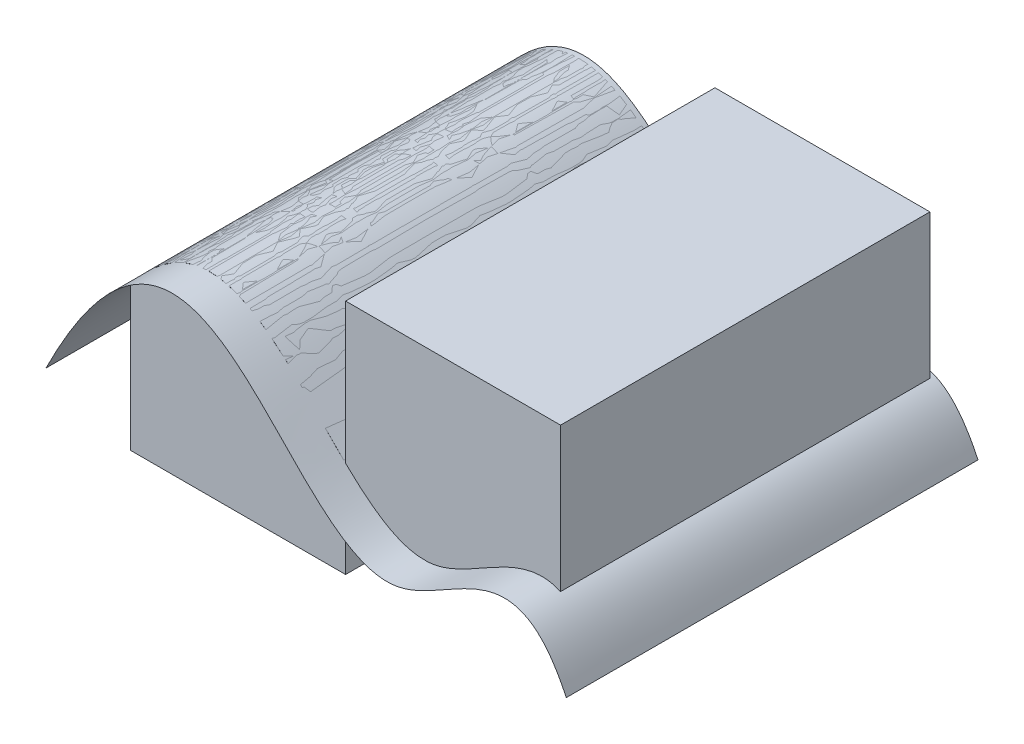
ISO-10303-21;
HEADER;
FILE_DESCRIPTION(('STEP AP214'),'2;1');
FILE_NAME('part.step','',(''),(''),'','','');
FILE_SCHEMA(('AUTOMOTIVE_DESIGN { 1 0 10303 214 1 1 1 1 }'));
ENDSEC;
DATA;
#1=APPLICATION_CONTEXT('core data for automotive mechanical design processes');
#2=APPLICATION_PROTOCOL_DEFINITION('international standard','automotive_design',2000,#1);
#3=PRODUCT_CONTEXT('',#1,'mechanical');
#4=PRODUCT('Part','Part','',(#3));
#5=PRODUCT_RELATED_PRODUCT_CATEGORY('part','',(#4));
#6=PRODUCT_DEFINITION_FORMATION('','',#4);
#7=PRODUCT_DEFINITION_CONTEXT('part definition',#1,'design');
#8=PRODUCT_DEFINITION('design','',#6,#7);
#9=PRODUCT_DEFINITION_SHAPE('','',#8);
#10=(LENGTH_UNIT() NAMED_UNIT(*) SI_UNIT(.MILLI.,.METRE.));
#11=(NAMED_UNIT(*) PLANE_ANGLE_UNIT() SI_UNIT($,.RADIAN.));
#12=(NAMED_UNIT(*) SI_UNIT($,.STERADIAN.) SOLID_ANGLE_UNIT());
#13=UNCERTAINTY_MEASURE_WITH_UNIT(LENGTH_MEASURE(1.E-05),#10,'distance_accuracy_value','');
#14=(GEOMETRIC_REPRESENTATION_CONTEXT(3) GLOBAL_UNCERTAINTY_ASSIGNED_CONTEXT((#13)) GLOBAL_UNIT_ASSIGNED_CONTEXT((#10,
#11,#12)) REPRESENTATION_CONTEXT('',''));
#15=CARTESIAN_POINT('',(0.,0.,0.));
#16=DIRECTION('',(0.,0.,1.));
#17=DIRECTION('',(1.,0.,0.));
#18=AXIS2_PLACEMENT_3D('',#15,#16,#17);
#19=CARTESIAN_POINT('',(0.,0.,0.));
#20=DIRECTION('',(1.,0.,0.));
#21=DIRECTION('',(0.,0.,-1.));
#22=AXIS2_PLACEMENT_3D('',#19,#20,#21);
#23=PLANE('',#22);
#24=DIRECTION('',(0.,0.,1.));
#25=VECTOR('',#24,1.);
#26=CARTESIAN_POINT('',(0.,0.,0.));
#27=LINE('',#26,#25);
#28=CARTESIAN_POINT('',(0.,0.,-62.6633162704457));
#29=VERTEX_POINT('',#28);
#30=CARTESIAN_POINT('',(0.,0.,62.6633162704457));
#31=VERTEX_POINT('',#30);
#32=EDGE_CURVE('E121',#29,#31,#27,.T.);
#33=ORIENTED_EDGE('',*,*,#32,.F.);
#34=DIRECTION('',(0.,1.,0.));
#35=VECTOR('',#34,1.);
#36=CARTESIAN_POINT('',(0.,80.3747042919709,-62.6633162704457));
#37=LINE('',#36,#35);
#38=CARTESIAN_POINT('',(-1.60461921527855E-13,32.6850280682945,-62.6633162704457));
#39=VERTEX_POINT('',#38);
#40=EDGE_CURVE('E129',#29,#39,#37,.T.);
#41=ORIENTED_EDGE('',*,*,#40,.T.);
#42=DIRECTION('',(0.,0.,-1.));
#43=VECTOR('',#42,1.);
#44=CARTESIAN_POINT('',(0.,32.6850280682944,62.6633162704457));
#45=LINE('',#44,#43);
#46=CARTESIAN_POINT('',(-1.60461921527855E-13,32.6850280682945,62.6633162704457));
#47=VERTEX_POINT('',#46);
#48=EDGE_CURVE('E123',#47,#39,#45,.T.);
#49=ORIENTED_EDGE('',*,*,#48,.F.);
#50=DIRECTION('',(0.,-1.,0.));
#51=VECTOR('',#50,1.);
#52=CARTESIAN_POINT('',(0.,80.3747042919709,62.6633162704457));
#53=LINE('',#52,#51);
#54=EDGE_CURVE('E112',#47,#31,#53,.T.);
#55=ORIENTED_EDGE('',*,*,#54,.T.);
#56=EDGE_LOOP('',(#33,#41,#49,#55));
#57=FACE_BOUND('',#56,.T.);
#58=ADVANCED_FACE('F67',(#57),#23,.T.);
#59=CARTESIAN_POINT('',(-88.9503624856376,22.5454685632026,62.6633162704457));
#60=CARTESIAN_POINT('',(-37.8141386567155,125.215292475116,62.6633162704457));
#61=CARTESIAN_POINT('',(5.84947542840995,-43.7179988687432,62.6633162704457));
#62=CARTESIAN_POINT('',(69.6437169043807,52.4820397279148,62.6633162704457));
#63=CARTESIAN_POINT('',(87.5841174456941,13.9727510125804,62.6633162704457));
#64=B_SPLINE_CURVE_WITH_KNOTS('',3,(#59,#60,#61,#62,#63),.UNSPECIFIED.,.F.,.F.,(4,1,4),(0.,
0.6650166527823,1.),.UNSPECIFIED.);
#65=DIRECTION('',(0.,0.,-1.));
#66=VECTOR('',#65,1.);
#67=SURFACE_OF_LINEAR_EXTRUSION('',#64,#66);
#68=ORIENTED_EDGE('',*,*,#48,.T.);
#69=CARTESIAN_POINT('',(-88.9503624856376,22.5454685632026,-62.6633162704457));
#70=CARTESIAN_POINT('',(-37.8141386567155,125.215292475116,-62.6633162704457));
#71=CARTESIAN_POINT('',(5.84947542840995,-43.7179988687432,-62.6633162704457));
#72=CARTESIAN_POINT('',(69.6437169043807,52.4820397279148,-62.6633162704457));
#73=CARTESIAN_POINT('',(87.5841174456941,13.9727510125804,-62.6633162704457));
#74=B_SPLINE_CURVE_WITH_KNOTS('',3,(#69,#70,#71,#72,#73),.UNSPECIFIED.,.F.,.F.,(4,1,4),(0.,
0.6650166527823,1.),.UNSPECIFIED.);
#75=CARTESIAN_POINT('',(-72.9401001387988,48.9314370628439,-62.6633162704457));
#76=VERTEX_POINT('',#75);
#77=EDGE_CURVE('E132',#39,#76,#74,.F.);
#78=ORIENTED_EDGE('',*,*,#77,.T.);
#79=DIRECTION('',(0.,0.,-1.));
#80=VECTOR('',#79,1.);
#81=CARTESIAN_POINT('',(-72.9401001387988,48.9314370628439,62.6633162704457));
#82=LINE('',#81,#80);
#83=CARTESIAN_POINT('',(-72.9401001387988,48.9314370687057,62.6633162704457));
#84=VERTEX_POINT('',#83);
#85=EDGE_CURVE('E124',#76,#84,#82,.F.);
#86=ORIENTED_EDGE('',*,*,#85,.T.);
#87=CARTESIAN_POINT('',(-88.9503624856376,22.5454685632026,62.6633162704457));
#88=CARTESIAN_POINT('',(-37.8141386567155,125.215292475116,62.6633162704457));
#89=CARTESIAN_POINT('',(5.84947542840995,-43.7179988687432,62.6633162704457));
#90=CARTESIAN_POINT('',(69.6437169043807,52.4820397279148,62.6633162704457));
#91=CARTESIAN_POINT('',(87.5841174456941,13.9727510125804,62.6633162704457));
#92=B_SPLINE_CURVE_WITH_KNOTS('',3,(#87,#88,#89,#90,#91),.UNSPECIFIED.,.F.,.F.,(4,1,4),(0.,
0.6650166527823,1.),.UNSPECIFIED.);
#93=EDGE_CURVE('E125',#84,#47,#92,.T.);
#94=ORIENTED_EDGE('',*,*,#93,.T.);
#95=EDGE_LOOP('',(#68,#78,#86,#94));
#96=FACE_BOUND('',#95,.T.);
#97=ADVANCED_FACE('F69',(#96),#67,.T.);
#98=CARTESIAN_POINT('',(-72.9401001387988,80.3747042919709,62.6633162704457));
#99=DIRECTION('',(1.,0.,0.));
#100=DIRECTION('',(0.,0.,-1.));
#101=AXIS2_PLACEMENT_3D('',#98,#99,#100);
#102=PLANE('',#101);
#103=ORIENTED_EDGE('',*,*,#85,.F.);
#104=DIRECTION('',(0.,-1.,0.));
#105=VECTOR('',#104,1.);
#106=CARTESIAN_POINT('',(-72.9401001387988,80.3747042919709,-62.6633162704457));
#107=LINE('',#106,#105);
#108=CARTESIAN_POINT('',(-72.9401001387988,0.,-62.6633162704457));
#109=VERTEX_POINT('',#108);
#110=EDGE_CURVE('E86',#76,#109,#107,.T.);
#111=ORIENTED_EDGE('',*,*,#110,.T.);
#112=DIRECTION('',(0.,0.,1.));
#113=VECTOR('',#112,1.);
#114=CARTESIAN_POINT('',(-72.9401001387988,0.,62.6633162704457));
#115=LINE('',#114,#113);
#116=CARTESIAN_POINT('',(-72.9401001387988,0.,62.6633162704457));
#117=VERTEX_POINT('',#116);
#118=EDGE_CURVE('E78',#109,#117,#115,.T.);
#119=ORIENTED_EDGE('',*,*,#118,.T.);
#120=DIRECTION('',(0.,-1.,0.));
#121=VECTOR('',#120,1.);
#122=CARTESIAN_POINT('',(-72.9401001387988,80.3747042919709,62.6633162704457));
#123=LINE('',#122,#121);
#124=EDGE_CURVE('E93',#84,#117,#123,.T.);
#125=ORIENTED_EDGE('',*,*,#124,.F.);
#126=EDGE_LOOP('',(#103,#111,#119,#125));
#127=FACE_BOUND('',#126,.T.);
#128=ADVANCED_FACE('F151',(#127),#102,.F.);
#129=CARTESIAN_POINT('',(-72.9401001387988,80.3747042919709,62.6633162704457));
#130=DIRECTION('',(0.,0.,-1.));
#131=DIRECTION('',(-1.,0.,0.));
#132=AXIS2_PLACEMENT_3D('',#129,#130,#131);
#133=PLANE('',#132);
#134=ORIENTED_EDGE('',*,*,#54,.F.);
#135=ORIENTED_EDGE('',*,*,#93,.F.);
#136=ORIENTED_EDGE('',*,*,#124,.T.);
#137=DIRECTION('',(1.,0.,0.));
#138=VECTOR('',#137,1.);
#139=CARTESIAN_POINT('',(-72.9401001387988,0.,62.6633162704457));
#140=LINE('',#139,#138);
#141=EDGE_CURVE('E109',#117,#31,#140,.T.);
#142=ORIENTED_EDGE('',*,*,#141,.T.);
#143=EDGE_LOOP('',(#134,#135,#136,#142));
#144=FACE_BOUND('',#143,.T.);
#145=ADVANCED_FACE('F111',(#144),#133,.F.);
#146=CARTESIAN_POINT('',(-72.9401001387988,80.3747042919709,-62.6633162704457));
#147=DIRECTION('',(0.,0.,1.));
#148=DIRECTION('',(1.,0.,0.));
#149=AXIS2_PLACEMENT_3D('',#146,#147,#148);
#150=PLANE('',#149);
#151=ORIENTED_EDGE('',*,*,#40,.F.);
#152=DIRECTION('',(-1.,0.,0.));
#153=VECTOR('',#152,1.);
#154=CARTESIAN_POINT('',(-72.9401001387988,0.,-62.6633162704457));
#155=LINE('',#154,#153);
#156=EDGE_CURVE('E13',#29,#109,#155,.T.);
#157=ORIENTED_EDGE('',*,*,#156,.T.);
#158=ORIENTED_EDGE('',*,*,#110,.F.);
#159=ORIENTED_EDGE('',*,*,#77,.F.);
#160=EDGE_LOOP('',(#151,#157,#158,#159));
#161=FACE_BOUND('',#160,.T.);
#162=ADVANCED_FACE('F160',(#161),#150,.F.);
#163=CARTESIAN_POINT('',(0.,0.,0.));
#164=DIRECTION('',(0.,-1.,0.));
#165=DIRECTION('',(0.,0.,-1.));
#166=AXIS2_PLACEMENT_3D('',#163,#164,#165);
#167=PLANE('',#166);
#168=ORIENTED_EDGE('',*,*,#156,.F.);
#169=ORIENTED_EDGE('',*,*,#32,.T.);
#170=ORIENTED_EDGE('',*,*,#141,.F.);
#171=ORIENTED_EDGE('',*,*,#118,.F.);
#172=EDGE_LOOP('',(#168,#169,#170,#171));
#173=FACE_BOUND('',#172,.T.);
#174=ADVANCED_FACE('F127',(#173),#167,.T.);
#175=CLOSED_SHELL('',(#58,#97,#128,#145,#162,#174));
#176=MANIFOLD_SOLID_BREP('B2',#175);
#177=CARTESIAN_POINT('',(-88.9503624856376,22.5454685632026,62.6633162704457));
#178=CARTESIAN_POINT('',(-37.8141386567155,125.215292475116,62.6633162704457));
#179=CARTESIAN_POINT('',(5.84947542840995,-43.7179988687432,62.6633162704457));
#180=CARTESIAN_POINT('',(69.6437169043807,52.4820397279148,62.6633162704457));
#181=CARTESIAN_POINT('',(87.5841174456941,13.9727510125804,62.6633162704457));
#182=B_SPLINE_CURVE_WITH_KNOTS('',3,(#177,#178,#179,#180,#181),.UNSPECIFIED.,.F.,.F.,(4,1,4),
(0.,0.6650166527823,1.),.UNSPECIFIED.);
#183=DIRECTION('',(0.,0.,-1.));
#184=VECTOR('',#183,1.);
#185=SURFACE_OF_LINEAR_EXTRUSION('',#182,#184);
#186=DIRECTION('',(0.,0.,-1.));
#187=VECTOR('',#186,1.);
#188=CARTESIAN_POINT('',(72.9401001387998,31.4552387573265,62.6633162704457));
#189=LINE('',#188,#187);
#190=CARTESIAN_POINT('',(72.9401001387988,31.4552387571009,62.6633162704457));
#191=VERTEX_POINT('',#190);
#192=CARTESIAN_POINT('',(72.9401001387988,31.4552387571009,-62.6633162704457));
#193=VERTEX_POINT('',#192);
#194=EDGE_CURVE('E263',#191,#193,#189,.T.);
#195=ORIENTED_EDGE('',*,*,#194,.F.);
#196=CARTESIAN_POINT('',(-88.9503624856376,22.5454685632026,62.6633162704457));
#197=CARTESIAN_POINT('',(-37.8141386567155,125.215292475116,62.6633162704457));
#198=CARTESIAN_POINT('',(5.84947542840995,-43.7179988687432,62.6633162704457));
#199=CARTESIAN_POINT('',(69.6437169043807,52.4820397279148,62.6633162704457));
#200=CARTESIAN_POINT('',(87.5841174456941,13.9727510125804,62.6633162704457));
#201=B_SPLINE_CURVE_WITH_KNOTS('',3,(#196,#197,#198,#199,#200),.UNSPECIFIED.,.F.,.F.,(4,1,4),
(0.,0.6650166527823,1.),.UNSPECIFIED.);
#202=CARTESIAN_POINT('',(-1.60461921527855E-13,32.6850280682945,62.6633162704457));
#203=VERTEX_POINT('',#202);
#204=EDGE_CURVE('E271',#203,#191,#201,.T.);
#205=ORIENTED_EDGE('',*,*,#204,.F.);
#206=DIRECTION('',(0.,0.,-1.));
#207=VECTOR('',#206,1.);
#208=CARTESIAN_POINT('',(0.,32.6850280682944,62.6633162704457));
#209=LINE('',#208,#207);
#210=CARTESIAN_POINT('',(-1.60461921527855E-13,32.6850280682945,-62.6633162704457));
#211=VERTEX_POINT('',#210);
#212=EDGE_CURVE('E221',#203,#211,#209,.T.);
#213=ORIENTED_EDGE('',*,*,#212,.T.);
#214=CARTESIAN_POINT('',(-88.9503624856376,22.5454685632026,-62.6633162704457));
#215=CARTESIAN_POINT('',(-37.8141386567155,125.215292475116,-62.6633162704457));
#216=CARTESIAN_POINT('',(5.84947542840995,-43.7179988687432,-62.6633162704457));
#217=CARTESIAN_POINT('',(69.6437169043807,52.4820397279148,-62.6633162704457));
#218=CARTESIAN_POINT('',(87.5841174456941,13.9727510125804,-62.6633162704457));
#219=B_SPLINE_CURVE_WITH_KNOTS('',3,(#214,#215,#216,#217,#218),.UNSPECIFIED.,.F.,.F.,(4,1,4),
(0.,0.6650166527823,1.),.UNSPECIFIED.);
#220=EDGE_CURVE('E259',#193,#211,#219,.F.);
#221=ORIENTED_EDGE('',*,*,#220,.F.);
#222=EDGE_LOOP('',(#195,#205,#213,#221));
#223=FACE_BOUND('',#222,.T.);
#224=ADVANCED_FACE('F217',(#223),#185,.F.);
#225=CARTESIAN_POINT('',(0.,0.,0.));
#226=DIRECTION('',(1.,0.,0.));
#227=DIRECTION('',(0.,0.,-1.));
#228=AXIS2_PLACEMENT_3D('',#225,#226,#227);
#229=PLANE('',#228);
#230=ORIENTED_EDGE('',*,*,#212,.F.);
#231=DIRECTION('',(0.,-1.,0.));
#232=VECTOR('',#231,1.);
#233=CARTESIAN_POINT('',(0.,80.3747042919709,62.6633162704457));
#234=LINE('',#233,#232);
#235=CARTESIAN_POINT('',(0.,80.3747042919709,62.6633162704457));
#236=VERTEX_POINT('',#235);
#237=EDGE_CURVE('E269',#236,#203,#234,.T.);
#238=ORIENTED_EDGE('',*,*,#237,.F.);
#239=DIRECTION('',(0.,0.,1.));
#240=VECTOR('',#239,1.);
#241=CARTESIAN_POINT('',(0.,80.3747042919709,0.));
#242=LINE('',#241,#240);
#243=CARTESIAN_POINT('',(0.,80.3747042919709,-62.6633162704457));
#244=VERTEX_POINT('',#243);
#245=EDGE_CURVE('E266',#244,#236,#242,.T.);
#246=ORIENTED_EDGE('',*,*,#245,.F.);
#247=DIRECTION('',(0.,1.,0.));
#248=VECTOR('',#247,1.);
#249=CARTESIAN_POINT('',(0.,80.3747042919709,-62.6633162704457));
#250=LINE('',#249,#248);
#251=EDGE_CURVE('E257',#211,#244,#250,.T.);
#252=ORIENTED_EDGE('',*,*,#251,.F.);
#253=EDGE_LOOP('',(#230,#238,#246,#252));
#254=FACE_BOUND('',#253,.T.);
#255=ADVANCED_FACE('F267',(#254),#229,.F.);
#256=CARTESIAN_POINT('',(72.9401001387988,80.3747042919709,62.6633162704457));
#257=DIRECTION('',(-1.,0.,0.));
#258=DIRECTION('',(0.,0.,1.));
#259=AXIS2_PLACEMENT_3D('',#256,#257,#258);
#260=PLANE('',#259);
#261=DIRECTION('',(0.,-1.,0.));
#262=VECTOR('',#261,1.);
#263=CARTESIAN_POINT('',(72.9401001387988,80.3747042919709,62.6633162704457));
#264=LINE('',#263,#262);
#265=CARTESIAN_POINT('',(72.9401001387988,80.3747042919709,62.6633162704457));
#266=VERTEX_POINT('',#265);
#267=EDGE_CURVE('E277',#266,#191,#264,.T.);
#268=ORIENTED_EDGE('',*,*,#267,.T.);
#269=ORIENTED_EDGE('',*,*,#194,.T.);
#270=DIRECTION('',(0.,-1.,0.));
#271=VECTOR('',#270,1.);
#272=CARTESIAN_POINT('',(72.9401001387988,80.3747042919709,-62.6633162704457));
#273=LINE('',#272,#271);
#274=CARTESIAN_POINT('',(72.9401001387988,80.3747042919709,-62.6633162704457));
#275=VERTEX_POINT('',#274);
#276=EDGE_CURVE('E270',#275,#193,#273,.T.);
#277=ORIENTED_EDGE('',*,*,#276,.F.);
#278=DIRECTION('',(0.,0.,-1.));
#279=VECTOR('',#278,1.);
#280=CARTESIAN_POINT('',(72.9401001387988,80.3747042919709,62.6633162704457));
#281=LINE('',#280,#279);
#282=EDGE_CURVE('E65',#266,#275,#281,.T.);
#283=ORIENTED_EDGE('',*,*,#282,.F.);
#284=EDGE_LOOP('',(#268,#269,#277,#283));
#285=FACE_BOUND('',#284,.T.);
#286=ADVANCED_FACE('F311',(#285),#260,.F.);
#287=CARTESIAN_POINT('',(-72.9401001387988,80.3747042919709,62.6633162704457));
#288=DIRECTION('',(0.,0.,-1.));
#289=DIRECTION('',(-1.,0.,0.));
#290=AXIS2_PLACEMENT_3D('',#287,#288,#289);
#291=PLANE('',#290);
#292=DIRECTION('',(1.,0.,0.));
#293=VECTOR('',#292,1.);
#294=CARTESIAN_POINT('',(-72.9401001387988,80.3747042919709,62.6633162704457));
#295=LINE('',#294,#293);
#296=EDGE_CURVE('E239',#236,#266,#295,.T.);
#297=ORIENTED_EDGE('',*,*,#296,.F.);
#298=ORIENTED_EDGE('',*,*,#237,.T.);
#299=ORIENTED_EDGE('',*,*,#204,.T.);
#300=ORIENTED_EDGE('',*,*,#267,.F.);
#301=EDGE_LOOP('',(#297,#298,#299,#300));
#302=FACE_BOUND('',#301,.T.);
#303=ADVANCED_FACE('F309',(#302),#291,.F.);
#304=CARTESIAN_POINT('',(-72.9401001387988,80.3747042919709,-62.6633162704457));
#305=DIRECTION('',(0.,0.,1.));
#306=DIRECTION('',(1.,0.,0.));
#307=AXIS2_PLACEMENT_3D('',#304,#305,#306);
#308=PLANE('',#307);
#309=ORIENTED_EDGE('',*,*,#220,.T.);
#310=ORIENTED_EDGE('',*,*,#251,.T.);
#311=DIRECTION('',(-1.,0.,0.));
#312=VECTOR('',#311,1.);
#313=CARTESIAN_POINT('',(-72.9401001387988,80.3747042919709,-62.6633162704457));
#314=LINE('',#313,#312);
#315=EDGE_CURVE('E226',#275,#244,#314,.T.);
#316=ORIENTED_EDGE('',*,*,#315,.F.);
#317=ORIENTED_EDGE('',*,*,#276,.T.);
#318=EDGE_LOOP('',(#309,#310,#316,#317));
#319=FACE_BOUND('',#318,.T.);
#320=ADVANCED_FACE('F219',(#319),#308,.F.);
#321=CARTESIAN_POINT('',(0.,80.3747042919709,0.));
#322=DIRECTION('',(0.,-1.,0.));
#323=DIRECTION('',(0.,0.,-1.));
#324=AXIS2_PLACEMENT_3D('',#321,#322,#323);
#325=PLANE('',#324);
#326=ORIENTED_EDGE('',*,*,#315,.T.);
#327=ORIENTED_EDGE('',*,*,#245,.T.);
#328=ORIENTED_EDGE('',*,*,#296,.T.);
#329=ORIENTED_EDGE('',*,*,#282,.T.);
#330=EDGE_LOOP('',(#326,#327,#328,#329));
#331=FACE_BOUND('',#330,.T.);
#332=ADVANCED_FACE('F273',(#331),#325,.F.);
#333=CLOSED_SHELL('',(#224,#255,#286,#303,#320,#332));
#334=MANIFOLD_SOLID_BREP('B7',#333);
#335=CARTESIAN_POINT('',(-88.9503624856376,22.5454685632026,62.6633162704457));
#336=CARTESIAN_POINT('',(-37.8141386567155,125.215292475116,62.6633162704457));
#337=CARTESIAN_POINT('',(5.84947542840995,-43.7179988687432,62.6633162704457));
#338=CARTESIAN_POINT('',(69.6437169043807,52.4820397279148,62.6633162704457));
#339=CARTESIAN_POINT('',(87.5841174456941,13.9727510125804,62.6633162704457));
#340=B_SPLINE_CURVE_WITH_KNOTS('',3,(#335,#336,#337,#338,#339),.UNSPECIFIED.,.F.,.F.,(4,1,4),
(0.,0.6650166527823,1.),.UNSPECIFIED.);
#341=DIRECTION('',(0.,0.,-1.));
#342=VECTOR('',#341,1.);
#343=SURFACE_OF_LINEAR_EXTRUSION('',#340,#342);
#344=CARTESIAN_POINT('',(-88.9503624856376,22.5454685632026,-64.3366837295543));
#345=CARTESIAN_POINT('',(-37.8141386567155,125.215292475116,-64.3366837295543));
#346=CARTESIAN_POINT('',(5.84947542840995,-43.7179988687432,-64.3366837295543));
#347=CARTESIAN_POINT('',(69.6437169043807,52.4820397279148,-64.3366837295543));
#348=CARTESIAN_POINT('',(87.5841174456941,13.9727510125804,-64.3366837295543));
#349=B_SPLINE_CURVE_WITH_KNOTS('',3,(#344,#345,#346,#347,#348),.UNSPECIFIED.,.F.,.F.,(4,1,4),
(0.,0.6650166527823,1.),.UNSPECIFIED.);
#350=CARTESIAN_POINT('',(-88.9503624856376,22.5454685632026,-64.3366837295543));
#351=VERTEX_POINT('',#350);
#352=CARTESIAN_POINT('',(87.5841174456941,13.9727510125804,-64.3366837295543));
#353=VERTEX_POINT('',#352);
#354=EDGE_CURVE('E367',#351,#353,#349,.T.);
#355=ORIENTED_EDGE('',*,*,#354,.F.);
#356=DIRECTION('',(0.,0.,-1.));
#357=VECTOR('',#356,1.);
#358=CARTESIAN_POINT('',(-88.9503624856376,22.5454685632026,62.6633162704457));
#359=LINE('',#358,#357);
#360=CARTESIAN_POINT('',(-88.9503624856376,22.5454685632026,75.3633162704457));
#361=VERTEX_POINT('',#360);
#362=EDGE_CURVE('E359',#361,#351,#359,.T.);
#363=ORIENTED_EDGE('',*,*,#362,.F.);
#364=CARTESIAN_POINT('',(-88.9503624856376,22.5454685632026,75.3633162704457));
#365=CARTESIAN_POINT('',(-37.8141386567155,125.215292475116,75.3633162704457));
#366=CARTESIAN_POINT('',(5.84947542840995,-43.7179988687432,75.3633162704457));
#367=CARTESIAN_POINT('',(69.6437169043807,52.4820397279148,75.3633162704457));
#368=CARTESIAN_POINT('',(87.5841174456941,13.9727510125804,75.3633162704457));
#369=B_SPLINE_CURVE_WITH_KNOTS('',3,(#364,#365,#366,#367,#368),.UNSPECIFIED.,.F.,.F.,(4,1,4),
(0.,0.6650166527823,1.),.UNSPECIFIED.);
#370=CARTESIAN_POINT('',(87.5841174456941,13.9727510125804,75.3633162704457));
#371=VERTEX_POINT('',#370);
#372=EDGE_CURVE('E377',#361,#371,#369,.T.);
#373=ORIENTED_EDGE('',*,*,#372,.T.);
#374=DIRECTION('',(0.,0.,-1.));
#375=VECTOR('',#374,1.);
#376=CARTESIAN_POINT('',(87.5841174456941,13.9727510125804,62.6633162704457));
#377=LINE('',#376,#375);
#378=EDGE_CURVE('E215',#371,#353,#377,.T.);
#379=ORIENTED_EDGE('',*,*,#378,.T.);
#380=EDGE_LOOP('',(#355,#363,#373,#379));
#381=FACE_BOUND('',#380,.T.);
#382=ADVANCED_FACE('F357',(#381),#343,.T.);
#383=OPEN_SHELL('',(#382));
#384=SHELL_BASED_SURFACE_MODEL('B59',(#383));
#385=ADVANCED_BREP_SHAPE_REPRESENTATION('',(#18,#176,#334),#14);
#386=MANIFOLD_SURFACE_SHAPE_REPRESENTATION('',(#18,#384),#14);
#387=SHAPE_REPRESENTATION('',(#18),#14);
#388=SHAPE_DEFINITION_REPRESENTATION(#9,#387);
#389=SHAPE_REPRESENTATION_RELATIONSHIP('','',#387,#385);
#390=SHAPE_REPRESENTATION_RELATIONSHIP('','',#387,#386);
ENDSEC;
END-ISO-10303-21;
